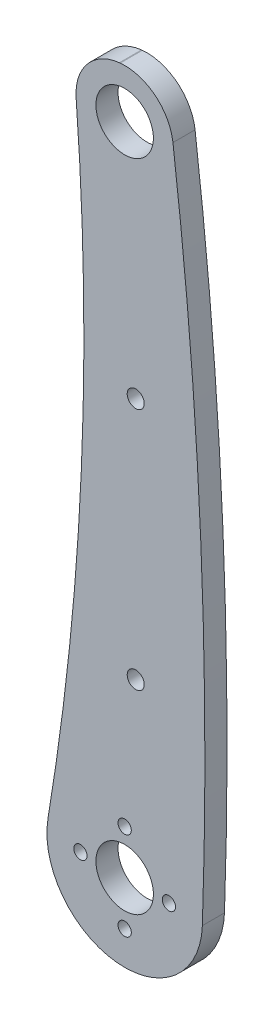
ISO-10303-21;
HEADER;
FILE_DESCRIPTION(('STEP AP214'),'2;1');
FILE_NAME('part.step','',(''),(''),'','','');
FILE_SCHEMA(('AUTOMOTIVE_DESIGN { 1 0 10303 214 1 1 1 1 }'));
ENDSEC;
DATA;
#1=APPLICATION_CONTEXT('core data for automotive mechanical design processes');
#2=APPLICATION_PROTOCOL_DEFINITION('international standard','automotive_design',2000,#1);
#3=PRODUCT_CONTEXT('',#1,'mechanical');
#4=PRODUCT('Part','Part','',(#3));
#5=PRODUCT_RELATED_PRODUCT_CATEGORY('part','',(#4));
#6=PRODUCT_DEFINITION_FORMATION('','',#4);
#7=PRODUCT_DEFINITION_CONTEXT('part definition',#1,'design');
#8=PRODUCT_DEFINITION('design','',#6,#7);
#9=PRODUCT_DEFINITION_SHAPE('','',#8);
#10=(LENGTH_UNIT() NAMED_UNIT(*) SI_UNIT(.MILLI.,.METRE.));
#11=(NAMED_UNIT(*) PLANE_ANGLE_UNIT() SI_UNIT($,.RADIAN.));
#12=(NAMED_UNIT(*) SI_UNIT($,.STERADIAN.) SOLID_ANGLE_UNIT());
#13=UNCERTAINTY_MEASURE_WITH_UNIT(LENGTH_MEASURE(1.E-05),#10,'distance_accuracy_value','');
#14=(GEOMETRIC_REPRESENTATION_CONTEXT(3) GLOBAL_UNCERTAINTY_ASSIGNED_CONTEXT((#13)) GLOBAL_UNIT_ASSIGNED_CONTEXT((#10,
#11,#12)) REPRESENTATION_CONTEXT('',''));
#15=CARTESIAN_POINT('',(0.,0.,0.));
#16=DIRECTION('',(0.,0.,1.));
#17=DIRECTION('',(1.,0.,0.));
#18=AXIS2_PLACEMENT_3D('',#15,#16,#17);
#19=CARTESIAN_POINT('',(1.11022302462516E-13,148.,5.));
#20=DIRECTION('',(0.,0.,1.));
#21=DIRECTION('',(1.,0.,0.));
#22=AXIS2_PLACEMENT_3D('',#19,#20,#21);
#23=PLANE('',#22);
#24=CARTESIAN_POINT('',(1.11022302462516E-13,-10.,5.));
#25=DIRECTION('',(0.,0.,1.));
#26=DIRECTION('',(1.,0.,0.));
#27=AXIS2_PLACEMENT_3D('',#24,#25,#26);
#28=CIRCLE('',#27,1.5);
#29=CARTESIAN_POINT('',(1.50000000000011,-10.,5.));
#30=VERTEX_POINT('',#29);
#31=EDGE_CURVE('E223',#30,#30,#28,.T.);
#32=ORIENTED_EDGE('',*,*,#31,.F.);
#33=EDGE_LOOP('',(#32));
#34=FACE_BOUND('',#33,.T.);
#35=CARTESIAN_POINT('',(-9.99999999999979,0.,5.));
#36=DIRECTION('',(0.,0.,1.));
#37=DIRECTION('',(1.,0.,0.));
#38=AXIS2_PLACEMENT_3D('',#35,#36,#37);
#39=CIRCLE('',#38,1.5);
#40=CARTESIAN_POINT('',(-8.49999999999979,0.,5.));
#41=VERTEX_POINT('',#40);
#42=EDGE_CURVE('E217',#41,#41,#39,.T.);
#43=ORIENTED_EDGE('',*,*,#42,.F.);
#44=EDGE_LOOP('',(#43));
#45=FACE_BOUND('',#44,.T.);
#46=CARTESIAN_POINT('',(10.0000000000001,0.,5.));
#47=DIRECTION('',(0.,0.,1.));
#48=DIRECTION('',(1.,0.,0.));
#49=AXIS2_PLACEMENT_3D('',#46,#47,#48);
#50=CIRCLE('',#49,1.5);
#51=CARTESIAN_POINT('',(11.5000000000001,0.,5.));
#52=VERTEX_POINT('',#51);
#53=EDGE_CURVE('E211',#52,#52,#50,.T.);
#54=ORIENTED_EDGE('',*,*,#53,.F.);
#55=EDGE_LOOP('',(#54));
#56=FACE_BOUND('',#55,.T.);
#57=CARTESIAN_POINT('',(0.,9.99999999999997,5.));
#58=DIRECTION('',(0.,0.,1.));
#59=DIRECTION('',(1.,0.,0.));
#60=AXIS2_PLACEMENT_3D('',#57,#58,#59);
#61=CIRCLE('',#60,1.5);
#62=CARTESIAN_POINT('',(1.5,9.99999999999997,5.));
#63=VERTEX_POINT('',#62);
#64=EDGE_CURVE('E205',#63,#63,#61,.T.);
#65=ORIENTED_EDGE('',*,*,#64,.F.);
#66=EDGE_LOOP('',(#65));
#67=FACE_BOUND('',#66,.T.);
#68=CARTESIAN_POINT('',(0.,0.,5.));
#69=DIRECTION('',(0.,0.,1.));
#70=DIRECTION('',(1.,0.,0.));
#71=AXIS2_PLACEMENT_3D('',#68,#69,#70);
#72=CIRCLE('',#71,6.49999999999995);
#73=CARTESIAN_POINT('',(6.49999999999995,0.,5.));
#74=VERTEX_POINT('',#73);
#75=EDGE_CURVE('E190',#74,#74,#72,.T.);
#76=ORIENTED_EDGE('',*,*,#75,.F.);
#77=EDGE_LOOP('',(#76));
#78=FACE_BOUND('',#77,.T.);
#79=CARTESIAN_POINT('',(2.50000000000039,40.,5.));
#80=DIRECTION('',(0.,0.,1.));
#81=DIRECTION('',(1.,0.,0.));
#82=AXIS2_PLACEMENT_3D('',#79,#80,#81);
#83=CIRCLE('',#82,1.92499999999995);
#84=CARTESIAN_POINT('',(4.42500000000035,40.,5.));
#85=VERTEX_POINT('',#84);
#86=EDGE_CURVE('E136',#85,#85,#83,.T.);
#87=ORIENTED_EDGE('',*,*,#86,.F.);
#88=EDGE_LOOP('',(#87));
#89=FACE_BOUND('',#88,.T.);
#90=CARTESIAN_POINT('',(1.11022302462516E-13,148.,5.));
#91=DIRECTION('',(0.,0.,1.));
#92=DIRECTION('',(1.,0.,0.));
#93=AXIS2_PLACEMENT_3D('',#90,#91,#92);
#94=CIRCLE('',#93,10.9999999999999);
#95=CARTESIAN_POINT('',(-1.1971466455013,158.93466231345,5.));
#96=VERTEX_POINT('',#95);
#97=CARTESIAN_POINT('',(-10.96780908015,147.159069573999,5.));
#98=VERTEX_POINT('',#97);
#99=EDGE_CURVE('E147',#96,#98,#94,.T.);
#100=ORIENTED_EDGE('',*,*,#99,.T.);
#101=CARTESIAN_POINT('',(-609.211940724704,101.290137246623,5.));
#102=DIRECTION('',(0.,0.,-1.));
#103=DIRECTION('',(1.,0.,0.));
#104=AXIS2_PLACEMENT_3D('',#101,#102,#103);
#105=CIRCLE('',#104,600.);
#106=CARTESIAN_POINT('',(-17.3370033732542,2.88252303300041,5.));
#107=VERTEX_POINT('',#106);
#108=EDGE_CURVE('E95',#98,#107,#105,.T.);
#109=ORIENTED_EDGE('',*,*,#108,.T.);
#110=CARTESIAN_POINT('',(0.,0.,5.));
#111=DIRECTION('',(0.,0.,1.));
#112=DIRECTION('',(1.,0.,0.));
#113=AXIS2_PLACEMENT_3D('',#110,#111,#112);
#114=CIRCLE('',#113,17.5750000000002);
#115=CARTESIAN_POINT('',(-1.85006543620891,-17.4773534289876,5.));
#116=VERTEX_POINT('',#115);
#117=EDGE_CURVE('E162',#107,#116,#114,.T.);
#118=ORIENTED_EDGE('',*,*,#117,.T.);
#119=DIRECTION('',(0.995026865441494,-0.0996069126600902,0.));
#120=VECTOR('',#119,1.);
#121=CARTESIAN_POINT('',(-1.85006543620891,-17.4773534289876,5.));
#122=LINE('',#121,#120);
#123=CARTESIAN_POINT('',(-1.6510608684687,-17.4972747309007,5.));
#124=VERTEX_POINT('',#123);
#125=EDGE_CURVE('E175',#116,#124,#122,.T.);
#126=ORIENTED_EDGE('',*,*,#125,.T.);
#127=CARTESIAN_POINT('',(0.,0.,5.));
#128=DIRECTION('',(0.,0.,1.));
#129=DIRECTION('',(1.,0.,0.));
#130=AXIS2_PLACEMENT_3D('',#127,#128,#129);
#131=CIRCLE('',#130,17.5750000000001);
#132=CARTESIAN_POINT('',(17.5643666056047,-0.611269779993512,5.));
#133=VERTEX_POINT('',#132);
#134=EDGE_CURVE('E114',#124,#133,#131,.T.);
#135=ORIENTED_EDGE('',*,*,#134,.T.);
#136=CARTESIAN_POINT('',(-931.860855318953,32.4303399493214,5.));
#137=DIRECTION('',(0.,0.,1.));
#138=DIRECTION('',(1.,0.,0.));
#139=AXIS2_PLACEMENT_3D('',#136,#137,#138);
#140=CIRCLE('',#139,950.);
#141=CARTESIAN_POINT('',(10.9163678471876,149.353851182696,5.));
#142=VERTEX_POINT('',#141);
#143=EDGE_CURVE('E108',#133,#142,#140,.T.);
#144=ORIENTED_EDGE('',*,*,#143,.T.);
#145=CARTESIAN_POINT('',(1.11022302462516E-13,148.,5.));
#146=DIRECTION('',(0.,0.,1.));
#147=DIRECTION('',(1.,0.,0.));
#148=AXIS2_PLACEMENT_3D('',#145,#146,#147);
#149=CIRCLE('',#148,10.9999999999998);
#150=CARTESIAN_POINT('',(-0.998147001194272,158.954620146952,5.));
#151=VERTEX_POINT('',#150);
#152=EDGE_CURVE('E112',#142,#151,#149,.T.);
#153=ORIENTED_EDGE('',*,*,#152,.T.);
#154=DIRECTION('',(-0.995008500617419,-0.0997901984118465,0.));
#155=VECTOR('',#154,1.);
#156=CARTESIAN_POINT('',(-1.1971466455013,158.93466231345,5.));
#157=LINE('',#156,#155);
#158=EDGE_CURVE('E52',#151,#96,#157,.T.);
#159=ORIENTED_EDGE('',*,*,#158,.T.);
#160=EDGE_LOOP('',(#100,#109,#118,#126,#135,#144,#153,#159));
#161=FACE_BOUND('',#160,.T.);
#162=CARTESIAN_POINT('',(2.50000000000039,95.0000000000001,5.));
#163=DIRECTION('',(0.,0.,1.));
#164=DIRECTION('',(1.,0.,0.));
#165=AXIS2_PLACEMENT_3D('',#162,#163,#164);
#166=CIRCLE('',#165,1.92499999999995);
#167=CARTESIAN_POINT('',(4.42500000000035,95.0000000000001,5.));
#168=VERTEX_POINT('',#167);
#169=EDGE_CURVE('E184',#168,#168,#166,.T.);
#170=ORIENTED_EDGE('',*,*,#169,.F.);
#171=EDGE_LOOP('',(#170));
#172=FACE_BOUND('',#171,.T.);
#173=CARTESIAN_POINT('',(1.11022302462516E-13,148.,5.));
#174=DIRECTION('',(0.,0.,1.));
#175=DIRECTION('',(1.,0.,0.));
#176=AXIS2_PLACEMENT_3D('',#173,#174,#175);
#177=CIRCLE('',#176,6.49999999999995);
#178=CARTESIAN_POINT('',(6.50000000000006,148.,5.));
#179=VERTEX_POINT('',#178);
#180=EDGE_CURVE('E196',#179,#179,#177,.T.);
#181=ORIENTED_EDGE('',*,*,#180,.F.);
#182=EDGE_LOOP('',(#181));
#183=FACE_BOUND('',#182,.T.);
#184=ADVANCED_FACE('F35',(#34,#45,#56,#67,#78,#89,#161,#172,#183),#23,.T.);
#185=CARTESIAN_POINT('',(1.11022302462516E-13,148.,0.));
#186=DIRECTION('',(0.,0.,1.));
#187=DIRECTION('',(1.,0.,0.));
#188=AXIS2_PLACEMENT_3D('',#185,#186,#187);
#189=PLANE('',#188);
#190=CARTESIAN_POINT('',(1.11022302462516E-13,-10.,0.));
#191=DIRECTION('',(0.,0.,1.));
#192=DIRECTION('',(1.,0.,0.));
#193=AXIS2_PLACEMENT_3D('',#190,#191,#192);
#194=CIRCLE('',#193,1.5);
#195=CARTESIAN_POINT('',(1.50000000000011,-10.,0.));
#196=VERTEX_POINT('',#195);
#197=EDGE_CURVE('E220',#196,#196,#194,.T.);
#198=ORIENTED_EDGE('',*,*,#197,.T.);
#199=EDGE_LOOP('',(#198));
#200=FACE_BOUND('',#199,.T.);
#201=CARTESIAN_POINT('',(-9.99999999999979,0.,0.));
#202=DIRECTION('',(0.,0.,1.));
#203=DIRECTION('',(1.,0.,0.));
#204=AXIS2_PLACEMENT_3D('',#201,#202,#203);
#205=CIRCLE('',#204,1.5);
#206=CARTESIAN_POINT('',(-8.49999999999979,0.,0.));
#207=VERTEX_POINT('',#206);
#208=EDGE_CURVE('E214',#207,#207,#205,.T.);
#209=ORIENTED_EDGE('',*,*,#208,.T.);
#210=EDGE_LOOP('',(#209));
#211=FACE_BOUND('',#210,.T.);
#212=CARTESIAN_POINT('',(10.0000000000001,0.,0.));
#213=DIRECTION('',(0.,0.,1.));
#214=DIRECTION('',(1.,0.,0.));
#215=AXIS2_PLACEMENT_3D('',#212,#213,#214);
#216=CIRCLE('',#215,1.5);
#217=CARTESIAN_POINT('',(11.5000000000001,0.,0.));
#218=VERTEX_POINT('',#217);
#219=EDGE_CURVE('E208',#218,#218,#216,.T.);
#220=ORIENTED_EDGE('',*,*,#219,.T.);
#221=EDGE_LOOP('',(#220));
#222=FACE_BOUND('',#221,.T.);
#223=CARTESIAN_POINT('',(0.,9.99999999999997,0.));
#224=DIRECTION('',(0.,0.,1.));
#225=DIRECTION('',(1.,0.,0.));
#226=AXIS2_PLACEMENT_3D('',#223,#224,#225);
#227=CIRCLE('',#226,1.5);
#228=CARTESIAN_POINT('',(1.5,9.99999999999997,0.));
#229=VERTEX_POINT('',#228);
#230=EDGE_CURVE('E202',#229,#229,#227,.T.);
#231=ORIENTED_EDGE('',*,*,#230,.T.);
#232=EDGE_LOOP('',(#231));
#233=FACE_BOUND('',#232,.T.);
#234=CARTESIAN_POINT('',(0.,0.,0.));
#235=DIRECTION('',(0.,0.,1.));
#236=DIRECTION('',(1.,0.,0.));
#237=AXIS2_PLACEMENT_3D('',#234,#235,#236);
#238=CIRCLE('',#237,6.49999999999995);
#239=CARTESIAN_POINT('',(6.49999999999995,0.,0.));
#240=VERTEX_POINT('',#239);
#241=EDGE_CURVE('E193',#240,#240,#238,.T.);
#242=ORIENTED_EDGE('',*,*,#241,.T.);
#243=EDGE_LOOP('',(#242));
#244=FACE_BOUND('',#243,.T.);
#245=CARTESIAN_POINT('',(2.50000000000039,40.,0.));
#246=DIRECTION('',(0.,0.,1.));
#247=DIRECTION('',(1.,0.,0.));
#248=AXIS2_PLACEMENT_3D('',#245,#246,#247);
#249=CIRCLE('',#248,1.92499999999995);
#250=CARTESIAN_POINT('',(4.42500000000035,40.,0.));
#251=VERTEX_POINT('',#250);
#252=EDGE_CURVE('E181',#251,#251,#249,.T.);
#253=ORIENTED_EDGE('',*,*,#252,.T.);
#254=EDGE_LOOP('',(#253));
#255=FACE_BOUND('',#254,.T.);
#256=CARTESIAN_POINT('',(1.11022302462516E-13,148.,0.));
#257=DIRECTION('',(0.,0.,1.));
#258=DIRECTION('',(1.,0.,0.));
#259=AXIS2_PLACEMENT_3D('',#256,#257,#258);
#260=CIRCLE('',#259,10.9999999999999);
#261=CARTESIAN_POINT('',(-1.1971466455013,158.93466231345,0.));
#262=VERTEX_POINT('',#261);
#263=CARTESIAN_POINT('',(-10.96780908015,147.159069573999,0.));
#264=VERTEX_POINT('',#263);
#265=EDGE_CURVE('E132',#262,#264,#260,.T.);
#266=ORIENTED_EDGE('',*,*,#265,.F.);
#267=DIRECTION('',(-0.995008500617419,-0.0997901984118465,0.));
#268=VECTOR('',#267,1.);
#269=CARTESIAN_POINT('',(-1.1971466455013,158.93466231345,0.));
#270=LINE('',#269,#268);
#271=CARTESIAN_POINT('',(-0.998147001194272,158.954620146952,0.));
#272=VERTEX_POINT('',#271);
#273=EDGE_CURVE('E87',#272,#262,#270,.T.);
#274=ORIENTED_EDGE('',*,*,#273,.F.);
#275=CARTESIAN_POINT('',(1.11022302462516E-13,148.,0.));
#276=DIRECTION('',(0.,0.,1.));
#277=DIRECTION('',(1.,0.,0.));
#278=AXIS2_PLACEMENT_3D('',#275,#276,#277);
#279=CIRCLE('',#278,10.9999999999998);
#280=CARTESIAN_POINT('',(10.9163678471876,149.353851182696,0.));
#281=VERTEX_POINT('',#280);
#282=EDGE_CURVE('E81',#281,#272,#279,.T.);
#283=ORIENTED_EDGE('',*,*,#282,.F.);
#284=CARTESIAN_POINT('',(-931.860855318953,32.4303399493214,0.));
#285=DIRECTION('',(0.,0.,1.));
#286=DIRECTION('',(1.,0.,0.));
#287=AXIS2_PLACEMENT_3D('',#284,#285,#286);
#288=CIRCLE('',#287,950.);
#289=CARTESIAN_POINT('',(17.5643666056047,-0.611269779993512,0.));
#290=VERTEX_POINT('',#289);
#291=EDGE_CURVE('E122',#290,#281,#288,.T.);
#292=ORIENTED_EDGE('',*,*,#291,.F.);
#293=CARTESIAN_POINT('',(0.,0.,0.));
#294=DIRECTION('',(0.,0.,1.));
#295=DIRECTION('',(1.,0.,0.));
#296=AXIS2_PLACEMENT_3D('',#293,#294,#295);
#297=CIRCLE('',#296,17.5750000000001);
#298=CARTESIAN_POINT('',(-1.6510608684687,-17.4972747309007,0.));
#299=VERTEX_POINT('',#298);
#300=EDGE_CURVE('E142',#299,#290,#297,.T.);
#301=ORIENTED_EDGE('',*,*,#300,.F.);
#302=DIRECTION('',(0.995026865441494,-0.0996069126600902,0.));
#303=VECTOR('',#302,1.);
#304=CARTESIAN_POINT('',(-1.85006543620891,-17.4773534289876,0.));
#305=LINE('',#304,#303);
#306=CARTESIAN_POINT('',(-1.85006543620891,-17.4773534289876,0.));
#307=VERTEX_POINT('',#306);
#308=EDGE_CURVE('E140',#307,#299,#305,.T.);
#309=ORIENTED_EDGE('',*,*,#308,.F.);
#310=CARTESIAN_POINT('',(0.,0.,0.));
#311=DIRECTION('',(0.,0.,1.));
#312=DIRECTION('',(1.,0.,0.));
#313=AXIS2_PLACEMENT_3D('',#310,#311,#312);
#314=CIRCLE('',#313,17.5750000000002);
#315=CARTESIAN_POINT('',(-17.3370033732542,2.88252303300041,0.));
#316=VERTEX_POINT('',#315);
#317=EDGE_CURVE('E138',#316,#307,#314,.T.);
#318=ORIENTED_EDGE('',*,*,#317,.F.);
#319=CARTESIAN_POINT('',(-609.211940724704,101.290137246623,0.));
#320=DIRECTION('',(0.,0.,-1.));
#321=DIRECTION('',(1.,0.,0.));
#322=AXIS2_PLACEMENT_3D('',#319,#320,#321);
#323=CIRCLE('',#322,600.);
#324=EDGE_CURVE('E135',#264,#316,#323,.T.);
#325=ORIENTED_EDGE('',*,*,#324,.F.);
#326=EDGE_LOOP('',(#266,#274,#283,#292,#301,#309,#318,#325));
#327=FACE_BOUND('',#326,.T.);
#328=CARTESIAN_POINT('',(2.50000000000039,95.0000000000001,0.));
#329=DIRECTION('',(0.,0.,1.));
#330=DIRECTION('',(1.,0.,0.));
#331=AXIS2_PLACEMENT_3D('',#328,#329,#330);
#332=CIRCLE('',#331,1.92499999999995);
#333=CARTESIAN_POINT('',(4.42500000000035,95.0000000000001,0.));
#334=VERTEX_POINT('',#333);
#335=EDGE_CURVE('E187',#334,#334,#332,.T.);
#336=ORIENTED_EDGE('',*,*,#335,.T.);
#337=EDGE_LOOP('',(#336));
#338=FACE_BOUND('',#337,.T.);
#339=CARTESIAN_POINT('',(1.11022302462516E-13,148.,0.));
#340=DIRECTION('',(0.,0.,1.));
#341=DIRECTION('',(1.,0.,0.));
#342=AXIS2_PLACEMENT_3D('',#339,#340,#341);
#343=CIRCLE('',#342,6.49999999999995);
#344=CARTESIAN_POINT('',(6.50000000000006,148.,0.));
#345=VERTEX_POINT('',#344);
#346=EDGE_CURVE('E199',#345,#345,#343,.T.);
#347=ORIENTED_EDGE('',*,*,#346,.T.);
#348=EDGE_LOOP('',(#347));
#349=FACE_BOUND('',#348,.T.);
#350=ADVANCED_FACE('F166',(#200,#211,#222,#233,#244,#255,#327,#338,#349),#189,.F.);
#351=CARTESIAN_POINT('',(1.11022302462516E-13,148.,5.));
#352=DIRECTION('',(0.,0.,-1.));
#353=DIRECTION('',(-1.,0.,0.));
#354=AXIS2_PLACEMENT_3D('',#351,#352,#353);
#355=CYLINDRICAL_SURFACE('',#354,10.9999999999999);
#356=ORIENTED_EDGE('',*,*,#265,.T.);
#357=DIRECTION('',(0.,0.,-1.));
#358=VECTOR('',#357,1.);
#359=CARTESIAN_POINT('',(-10.96780908015,147.159069573999,5.));
#360=LINE('',#359,#358);
#361=EDGE_CURVE('E11',#98,#264,#360,.T.);
#362=ORIENTED_EDGE('',*,*,#361,.F.);
#363=ORIENTED_EDGE('',*,*,#99,.F.);
#364=DIRECTION('',(0.,0.,-1.));
#365=VECTOR('',#364,1.);
#366=CARTESIAN_POINT('',(-1.1971466455013,158.93466231345,5.));
#367=LINE('',#366,#365);
#368=EDGE_CURVE('E128',#96,#262,#367,.T.);
#369=ORIENTED_EDGE('',*,*,#368,.T.);
#370=EDGE_LOOP('',(#356,#362,#363,#369));
#371=FACE_BOUND('',#370,.T.);
#372=ADVANCED_FACE('F37',(#371),#355,.T.);
#373=CARTESIAN_POINT('',(-609.211940724704,101.290137246623,5.));
#374=DIRECTION('',(0.,0.,-1.));
#375=DIRECTION('',(-1.,0.,0.));
#376=AXIS2_PLACEMENT_3D('',#373,#374,#375);
#377=CYLINDRICAL_SURFACE('',#376,600.);
#378=ORIENTED_EDGE('',*,*,#324,.T.);
#379=DIRECTION('',(0.,0.,-1.));
#380=VECTOR('',#379,1.);
#381=CARTESIAN_POINT('',(-17.3370033732542,2.88252303300041,5.));
#382=LINE('',#381,#380);
#383=EDGE_CURVE('E44',#107,#316,#382,.T.);
#384=ORIENTED_EDGE('',*,*,#383,.F.);
#385=ORIENTED_EDGE('',*,*,#108,.F.);
#386=ORIENTED_EDGE('',*,*,#361,.T.);
#387=EDGE_LOOP('',(#378,#384,#385,#386));
#388=FACE_BOUND('',#387,.T.);
#389=ADVANCED_FACE('F264',(#388),#377,.F.);
#390=CARTESIAN_POINT('',(0.,0.,5.));
#391=DIRECTION('',(0.,0.,-1.));
#392=DIRECTION('',(-1.,0.,0.));
#393=AXIS2_PLACEMENT_3D('',#390,#391,#392);
#394=CYLINDRICAL_SURFACE('',#393,17.5750000000002);
#395=ORIENTED_EDGE('',*,*,#317,.T.);
#396=DIRECTION('',(0.,0.,-1.));
#397=VECTOR('',#396,1.);
#398=CARTESIAN_POINT('',(-1.85006543620891,-17.4773534289876,5.));
#399=LINE('',#398,#397);
#400=EDGE_CURVE('E154',#116,#307,#399,.T.);
#401=ORIENTED_EDGE('',*,*,#400,.F.);
#402=ORIENTED_EDGE('',*,*,#117,.F.);
#403=ORIENTED_EDGE('',*,*,#383,.T.);
#404=EDGE_LOOP('',(#395,#401,#402,#403));
#405=FACE_BOUND('',#404,.T.);
#406=ADVANCED_FACE('F160',(#405),#394,.T.);
#407=CARTESIAN_POINT('',(-1.85006543620891,-17.4773534289876,5.));
#408=DIRECTION('',(0.0996069126600902,0.995026865441494,0.));
#409=DIRECTION('',(-0.995026865441494,0.0996069126600902,0.));
#410=AXIS2_PLACEMENT_3D('',#407,#408,#409);
#411=PLANE('',#410);
#412=ORIENTED_EDGE('',*,*,#308,.T.);
#413=DIRECTION('',(0.,0.,-1.));
#414=VECTOR('',#413,1.);
#415=CARTESIAN_POINT('',(-1.6510608684687,-17.4972747309007,5.));
#416=LINE('',#415,#414);
#417=EDGE_CURVE('E151',#124,#299,#416,.T.);
#418=ORIENTED_EDGE('',*,*,#417,.F.);
#419=ORIENTED_EDGE('',*,*,#125,.F.);
#420=ORIENTED_EDGE('',*,*,#400,.T.);
#421=EDGE_LOOP('',(#412,#418,#419,#420));
#422=FACE_BOUND('',#421,.T.);
#423=ADVANCED_FACE('F171',(#422),#411,.F.);
#424=CARTESIAN_POINT('',(0.,0.,5.));
#425=DIRECTION('',(0.,0.,-1.));
#426=DIRECTION('',(-1.,0.,0.));
#427=AXIS2_PLACEMENT_3D('',#424,#425,#426);
#428=CYLINDRICAL_SURFACE('',#427,17.5750000000001);
#429=ORIENTED_EDGE('',*,*,#300,.T.);
#430=DIRECTION('',(0.,0.,-1.));
#431=VECTOR('',#430,1.);
#432=CARTESIAN_POINT('',(17.5643666056047,-0.611269779993512,5.));
#433=LINE('',#432,#431);
#434=EDGE_CURVE('E123',#133,#290,#433,.T.);
#435=ORIENTED_EDGE('',*,*,#434,.F.);
#436=ORIENTED_EDGE('',*,*,#134,.F.);
#437=ORIENTED_EDGE('',*,*,#417,.T.);
#438=EDGE_LOOP('',(#429,#435,#436,#437));
#439=FACE_BOUND('',#438,.T.);
#440=ADVANCED_FACE('F174',(#439),#428,.T.);
#441=CARTESIAN_POINT('',(-931.860855318953,32.4303399493214,5.));
#442=DIRECTION('',(0.,0.,-1.));
#443=DIRECTION('',(-1.,0.,0.));
#444=AXIS2_PLACEMENT_3D('',#441,#442,#443);
#445=CYLINDRICAL_SURFACE('',#444,950.);
#446=ORIENTED_EDGE('',*,*,#291,.T.);
#447=DIRECTION('',(0.,0.,-1.));
#448=VECTOR('',#447,1.);
#449=CARTESIAN_POINT('',(10.9163678471876,149.353851182696,5.));
#450=LINE('',#449,#448);
#451=EDGE_CURVE('E119',#142,#281,#450,.T.);
#452=ORIENTED_EDGE('',*,*,#451,.F.);
#453=ORIENTED_EDGE('',*,*,#143,.F.);
#454=ORIENTED_EDGE('',*,*,#434,.T.);
#455=EDGE_LOOP('',(#446,#452,#453,#454));
#456=FACE_BOUND('',#455,.T.);
#457=ADVANCED_FACE('F120',(#456),#445,.T.);
#458=CARTESIAN_POINT('',(1.11022302462516E-13,148.,5.));
#459=DIRECTION('',(0.,0.,-1.));
#460=DIRECTION('',(-1.,0.,0.));
#461=AXIS2_PLACEMENT_3D('',#458,#459,#460);
#462=CYLINDRICAL_SURFACE('',#461,10.9999999999998);
#463=ORIENTED_EDGE('',*,*,#282,.T.);
#464=DIRECTION('',(0.,0.,-1.));
#465=VECTOR('',#464,1.);
#466=CARTESIAN_POINT('',(-0.998147001194272,158.954620146952,5.));
#467=LINE('',#466,#465);
#468=EDGE_CURVE('E124',#151,#272,#467,.T.);
#469=ORIENTED_EDGE('',*,*,#468,.F.);
#470=ORIENTED_EDGE('',*,*,#152,.F.);
#471=ORIENTED_EDGE('',*,*,#451,.T.);
#472=EDGE_LOOP('',(#463,#469,#470,#471));
#473=FACE_BOUND('',#472,.T.);
#474=ADVANCED_FACE('F126',(#473),#462,.T.);
#475=CARTESIAN_POINT('',(-1.1971466455013,158.93466231345,5.));
#476=DIRECTION('',(0.0997901984118465,-0.995008500617419,0.));
#477=DIRECTION('',(0.995008500617419,0.0997901984118465,0.));
#478=AXIS2_PLACEMENT_3D('',#475,#476,#477);
#479=PLANE('',#478);
#480=ORIENTED_EDGE('',*,*,#273,.T.);
#481=ORIENTED_EDGE('',*,*,#368,.F.);
#482=ORIENTED_EDGE('',*,*,#158,.F.);
#483=ORIENTED_EDGE('',*,*,#468,.T.);
#484=EDGE_LOOP('',(#480,#481,#482,#483));
#485=FACE_BOUND('',#484,.T.);
#486=ADVANCED_FACE('F255',(#485),#479,.F.);
#487=CARTESIAN_POINT('',(2.50000000000039,40.,5.));
#488=DIRECTION('',(0.,0.,-1.));
#489=DIRECTION('',(-1.,0.,0.));
#490=AXIS2_PLACEMENT_3D('',#487,#488,#489);
#491=CYLINDRICAL_SURFACE('',#490,1.92499999999995);
#492=ORIENTED_EDGE('',*,*,#86,.T.);
#493=EDGE_LOOP('',(#492));
#494=FACE_BOUND('',#493,.T.);
#495=ORIENTED_EDGE('',*,*,#252,.F.);
#496=EDGE_LOOP('',(#495));
#497=FACE_BOUND('',#496,.T.);
#498=ADVANCED_FACE('F251',(#494,#497),#491,.F.);
#499=CARTESIAN_POINT('',(2.50000000000039,95.0000000000001,5.));
#500=DIRECTION('',(0.,0.,-1.));
#501=DIRECTION('',(-1.,0.,0.));
#502=AXIS2_PLACEMENT_3D('',#499,#500,#501);
#503=CYLINDRICAL_SURFACE('',#502,1.92499999999995);
#504=ORIENTED_EDGE('',*,*,#169,.T.);
#505=EDGE_LOOP('',(#504));
#506=FACE_BOUND('',#505,.T.);
#507=ORIENTED_EDGE('',*,*,#335,.F.);
#508=EDGE_LOOP('',(#507));
#509=FACE_BOUND('',#508,.T.);
#510=ADVANCED_FACE('F254',(#506,#509),#503,.F.);
#511=CARTESIAN_POINT('',(0.,0.,5.));
#512=DIRECTION('',(0.,0.,-1.));
#513=DIRECTION('',(-1.,0.,0.));
#514=AXIS2_PLACEMENT_3D('',#511,#512,#513);
#515=CYLINDRICAL_SURFACE('',#514,6.49999999999995);
#516=ORIENTED_EDGE('',*,*,#75,.T.);
#517=EDGE_LOOP('',(#516));
#518=FACE_BOUND('',#517,.T.);
#519=ORIENTED_EDGE('',*,*,#241,.F.);
#520=EDGE_LOOP('',(#519));
#521=FACE_BOUND('',#520,.T.);
#522=ADVANCED_FACE('F319',(#518,#521),#515,.F.);
#523=CARTESIAN_POINT('',(1.11022302462516E-13,148.,5.));
#524=DIRECTION('',(0.,0.,-1.));
#525=DIRECTION('',(-1.,0.,0.));
#526=AXIS2_PLACEMENT_3D('',#523,#524,#525);
#527=CYLINDRICAL_SURFACE('',#526,6.49999999999995);
#528=ORIENTED_EDGE('',*,*,#180,.T.);
#529=EDGE_LOOP('',(#528));
#530=FACE_BOUND('',#529,.T.);
#531=ORIENTED_EDGE('',*,*,#346,.F.);
#532=EDGE_LOOP('',(#531));
#533=FACE_BOUND('',#532,.T.);
#534=ADVANCED_FACE('F327',(#530,#533),#527,.F.);
#535=CARTESIAN_POINT('',(0.,9.99999999999997,0.));
#536=DIRECTION('',(0.,0.,1.));
#537=DIRECTION('',(1.,0.,0.));
#538=AXIS2_PLACEMENT_3D('',#535,#536,#537);
#539=CYLINDRICAL_SURFACE('',#538,1.5);
#540=ORIENTED_EDGE('',*,*,#230,.F.);
#541=EDGE_LOOP('',(#540));
#542=FACE_BOUND('',#541,.T.);
#543=ORIENTED_EDGE('',*,*,#64,.T.);
#544=EDGE_LOOP('',(#543));
#545=FACE_BOUND('',#544,.T.);
#546=ADVANCED_FACE('F335',(#542,#545),#539,.F.);
#547=CARTESIAN_POINT('',(10.0000000000001,0.,0.));
#548=DIRECTION('',(0.,0.,1.));
#549=DIRECTION('',(1.,0.,0.));
#550=AXIS2_PLACEMENT_3D('',#547,#548,#549);
#551=CYLINDRICAL_SURFACE('',#550,1.5);
#552=ORIENTED_EDGE('',*,*,#219,.F.);
#553=EDGE_LOOP('',(#552));
#554=FACE_BOUND('',#553,.T.);
#555=ORIENTED_EDGE('',*,*,#53,.T.);
#556=EDGE_LOOP('',(#555));
#557=FACE_BOUND('',#556,.T.);
#558=ADVANCED_FACE('F344',(#554,#557),#551,.F.);
#559=CARTESIAN_POINT('',(-9.99999999999979,0.,0.));
#560=DIRECTION('',(0.,0.,1.));
#561=DIRECTION('',(1.,0.,0.));
#562=AXIS2_PLACEMENT_3D('',#559,#560,#561);
#563=CYLINDRICAL_SURFACE('',#562,1.5);
#564=ORIENTED_EDGE('',*,*,#208,.F.);
#565=EDGE_LOOP('',(#564));
#566=FACE_BOUND('',#565,.T.);
#567=ORIENTED_EDGE('',*,*,#42,.T.);
#568=EDGE_LOOP('',(#567));
#569=FACE_BOUND('',#568,.T.);
#570=ADVANCED_FACE('F234',(#566,#569),#563,.F.);
#571=CARTESIAN_POINT('',(1.11022302462516E-13,-10.,0.));
#572=DIRECTION('',(0.,0.,1.));
#573=DIRECTION('',(1.,0.,0.));
#574=AXIS2_PLACEMENT_3D('',#571,#572,#573);
#575=CYLINDRICAL_SURFACE('',#574,1.5);
#576=ORIENTED_EDGE('',*,*,#197,.F.);
#577=EDGE_LOOP('',(#576));
#578=FACE_BOUND('',#577,.T.);
#579=ORIENTED_EDGE('',*,*,#31,.T.);
#580=EDGE_LOOP('',(#579));
#581=FACE_BOUND('',#580,.T.);
#582=ADVANCED_FACE('F231',(#578,#581),#575,.F.);
#583=CLOSED_SHELL('',(#184,#350,#372,#389,#406,#423,#440,#457,#474,#486,#498,#510,#522,#534,
#546,#558,#570,#582));
#584=MANIFOLD_SOLID_BREP('B2',#583);
#585=ADVANCED_BREP_SHAPE_REPRESENTATION('',(#18,#584),#14);
#586=SHAPE_DEFINITION_REPRESENTATION(#9,#585);
ENDSEC;
END-ISO-10303-21;
